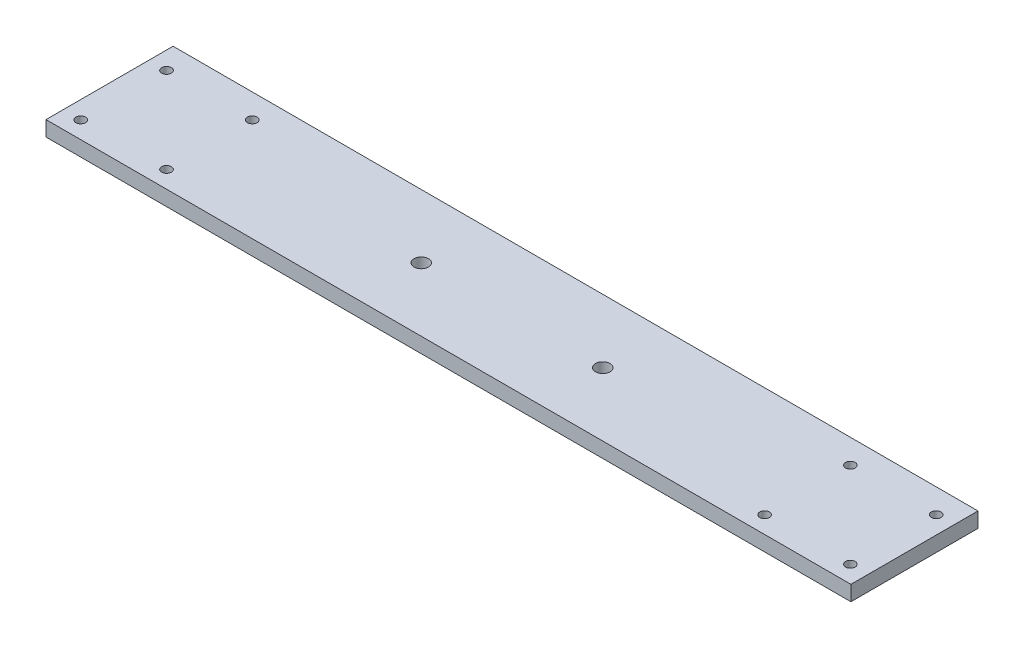
ISO-10303-21;
HEADER;
FILE_DESCRIPTION(('STEP AP214'),'2;1');
FILE_NAME('part.step','',(''),(''),'','','');
FILE_SCHEMA(('AUTOMOTIVE_DESIGN { 1 0 10303 214 1 1 1 1 }'));
ENDSEC;
DATA;
#1=APPLICATION_CONTEXT('core data for automotive mechanical design processes');
#2=APPLICATION_PROTOCOL_DEFINITION('international standard','automotive_design',2000,#1);
#3=PRODUCT_CONTEXT('',#1,'mechanical');
#4=PRODUCT('Part','Part','',(#3));
#5=PRODUCT_RELATED_PRODUCT_CATEGORY('part','',(#4));
#6=PRODUCT_DEFINITION_FORMATION('','',#4);
#7=PRODUCT_DEFINITION_CONTEXT('part definition',#1,'design');
#8=PRODUCT_DEFINITION('design','',#6,#7);
#9=PRODUCT_DEFINITION_SHAPE('','',#8);
#10=(LENGTH_UNIT() NAMED_UNIT(*) SI_UNIT(.MILLI.,.METRE.));
#11=(NAMED_UNIT(*) PLANE_ANGLE_UNIT() SI_UNIT($,.RADIAN.));
#12=(NAMED_UNIT(*) SI_UNIT($,.STERADIAN.) SOLID_ANGLE_UNIT());
#13=UNCERTAINTY_MEASURE_WITH_UNIT(LENGTH_MEASURE(1.E-05),#10,'distance_accuracy_value','');
#14=(GEOMETRIC_REPRESENTATION_CONTEXT(3) GLOBAL_UNCERTAINTY_ASSIGNED_CONTEXT((#13)) GLOBAL_UNIT_ASSIGNED_CONTEXT((#10,
#11,#12)) REPRESENTATION_CONTEXT('',''));
#15=CARTESIAN_POINT('',(0.,0.,0.));
#16=DIRECTION('',(0.,0.,1.));
#17=DIRECTION('',(1.,0.,0.));
#18=AXIS2_PLACEMENT_3D('',#15,#16,#17);
#19=CARTESIAN_POINT('',(0.,3.175,0.));
#20=DIRECTION('',(0.,1.,0.));
#21=DIRECTION('',(0.,0.,1.));
#22=AXIS2_PLACEMENT_3D('',#19,#20,#21);
#23=PLANE('',#22);
#24=CARTESIAN_POINT('',(19.05,3.175,-13.335));
#25=DIRECTION('',(0.,1.,0.));
#26=DIRECTION('',(0.,0.,1.));
#27=AXIS2_PLACEMENT_3D('',#24,#25,#26);
#28=CIRCLE('',#27,1.524);
#29=CARTESIAN_POINT('',(19.05,3.175,-11.811));
#30=VERTEX_POINT('',#29);
#31=EDGE_CURVE('E165',#30,#30,#28,.F.);
#32=ORIENTED_EDGE('',*,*,#31,.T.);
#33=EDGE_LOOP('',(#32));
#34=FACE_BOUND('',#33,.T.);
#35=CARTESIAN_POINT('',(-19.05,3.175,-13.335));
#36=DIRECTION('',(0.,1.,0.));
#37=DIRECTION('',(0.,0.,1.));
#38=AXIS2_PLACEMENT_3D('',#35,#36,#37);
#39=CIRCLE('',#38,1.524);
#40=CARTESIAN_POINT('',(-19.05,3.175,-11.811));
#41=VERTEX_POINT('',#40);
#42=EDGE_CURVE('E157',#41,#41,#39,.F.);
#43=ORIENTED_EDGE('',*,*,#42,.T.);
#44=EDGE_LOOP('',(#43));
#45=FACE_BOUND('',#44,.T.);
#46=CARTESIAN_POINT('',(-80.755,3.175,-21.59));
#47=DIRECTION('',(0.,1.,0.));
#48=DIRECTION('',(0.,0.,-1.));
#49=AXIS2_PLACEMENT_3D('',#46,#47,#48);
#50=CIRCLE('',#49,1.016);
#51=CARTESIAN_POINT('',(-80.755,3.175,-22.606));
#52=VERTEX_POINT('',#51);
#53=EDGE_CURVE('E145',#52,#52,#50,.T.);
#54=ORIENTED_EDGE('',*,*,#53,.F.);
#55=EDGE_LOOP('',(#54));
#56=FACE_BOUND('',#55,.T.);
#57=CARTESIAN_POINT('',(-80.755,3.175,-3.59));
#58=DIRECTION('',(0.,1.,0.));
#59=DIRECTION('',(0.,0.,-1.));
#60=AXIS2_PLACEMENT_3D('',#57,#58,#59);
#61=CIRCLE('',#60,1.016);
#62=CARTESIAN_POINT('',(-80.755,3.175,-4.606));
#63=VERTEX_POINT('',#62);
#64=EDGE_CURVE('E133',#63,#63,#61,.T.);
#65=ORIENTED_EDGE('',*,*,#64,.F.);
#66=EDGE_LOOP('',(#65));
#67=FACE_BOUND('',#66,.T.);
#68=CARTESIAN_POINT('',(62.755,3.175,-3.59000000000002));
#69=DIRECTION('',(0.,1.,0.));
#70=DIRECTION('',(0.,0.,1.));
#71=AXIS2_PLACEMENT_3D('',#68,#69,#70);
#72=CIRCLE('',#71,1.016);
#73=CARTESIAN_POINT('',(62.755,3.175,-2.57400000000002));
#74=VERTEX_POINT('',#73);
#75=EDGE_CURVE('E121',#74,#74,#72,.T.);
#76=ORIENTED_EDGE('',*,*,#75,.F.);
#77=EDGE_LOOP('',(#76));
#78=FACE_BOUND('',#77,.T.);
#79=CARTESIAN_POINT('',(62.755,3.175,-21.59));
#80=DIRECTION('',(0.,1.,0.));
#81=DIRECTION('',(0.,0.,1.));
#82=AXIS2_PLACEMENT_3D('',#79,#80,#81);
#83=CIRCLE('',#82,1.016);
#84=CARTESIAN_POINT('',(62.755,3.175,-20.574));
#85=VERTEX_POINT('',#84);
#86=EDGE_CURVE('E100',#85,#85,#83,.T.);
#87=ORIENTED_EDGE('',*,*,#86,.F.);
#88=EDGE_LOOP('',(#87));
#89=FACE_BOUND('',#88,.T.);
#90=DIRECTION('',(0.,0.,1.));
#91=VECTOR('',#90,1.);
#92=CARTESIAN_POINT('',(-84.455,3.175,0.));
#93=LINE('',#92,#91);
#94=CARTESIAN_POINT('',(-84.455,3.175,-26.67));
#95=VERTEX_POINT('',#94);
#96=CARTESIAN_POINT('',(-84.455,3.175,0.));
#97=VERTEX_POINT('',#96);
#98=EDGE_CURVE('E85',#95,#97,#93,.T.);
#99=ORIENTED_EDGE('',*,*,#98,.T.);
#100=DIRECTION('',(1.,0.,0.));
#101=VECTOR('',#100,1.);
#102=CARTESIAN_POINT('',(84.455,3.175,0.));
#103=LINE('',#102,#101);
#104=CARTESIAN_POINT('',(84.455,3.175,0.));
#105=VERTEX_POINT('',#104);
#106=EDGE_CURVE('E80',#97,#105,#103,.T.);
#107=ORIENTED_EDGE('',*,*,#106,.T.);
#108=DIRECTION('',(0.,0.,-1.));
#109=VECTOR('',#108,1.);
#110=CARTESIAN_POINT('',(84.455,3.175,0.));
#111=LINE('',#110,#109);
#112=CARTESIAN_POINT('',(84.455,3.175,-26.67));
#113=VERTEX_POINT('',#112);
#114=EDGE_CURVE('E83',#105,#113,#111,.T.);
#115=ORIENTED_EDGE('',*,*,#114,.T.);
#116=DIRECTION('',(-1.,0.,0.));
#117=VECTOR('',#116,1.);
#118=CARTESIAN_POINT('',(84.455,3.175,-26.67));
#119=LINE('',#118,#117);
#120=EDGE_CURVE('E50',#113,#95,#119,.T.);
#121=ORIENTED_EDGE('',*,*,#120,.T.);
#122=EDGE_LOOP('',(#99,#107,#115,#121));
#123=FACE_BOUND('',#122,.T.);
#124=CARTESIAN_POINT('',(80.755,3.175,-21.59));
#125=DIRECTION('',(0.,1.,0.));
#126=DIRECTION('',(0.,0.,1.));
#127=AXIS2_PLACEMENT_3D('',#124,#125,#126);
#128=CIRCLE('',#127,1.016);
#129=CARTESIAN_POINT('',(80.755,3.175,-20.574));
#130=VERTEX_POINT('',#129);
#131=EDGE_CURVE('E115',#130,#130,#128,.T.);
#132=ORIENTED_EDGE('',*,*,#131,.F.);
#133=EDGE_LOOP('',(#132));
#134=FACE_BOUND('',#133,.T.);
#135=CARTESIAN_POINT('',(80.755,3.175,-3.59000000000002));
#136=DIRECTION('',(0.,1.,0.));
#137=DIRECTION('',(0.,0.,1.));
#138=AXIS2_PLACEMENT_3D('',#135,#136,#137);
#139=CIRCLE('',#138,1.016);
#140=CARTESIAN_POINT('',(80.755,3.175,-2.57400000000002));
#141=VERTEX_POINT('',#140);
#142=EDGE_CURVE('E127',#141,#141,#139,.T.);
#143=ORIENTED_EDGE('',*,*,#142,.F.);
#144=EDGE_LOOP('',(#143));
#145=FACE_BOUND('',#144,.T.);
#146=CARTESIAN_POINT('',(-62.755,3.175,-3.59000000000001));
#147=DIRECTION('',(0.,1.,0.));
#148=DIRECTION('',(0.,0.,-1.));
#149=AXIS2_PLACEMENT_3D('',#146,#147,#148);
#150=CIRCLE('',#149,1.016);
#151=CARTESIAN_POINT('',(-62.755,3.175,-4.60600000000001));
#152=VERTEX_POINT('',#151);
#153=EDGE_CURVE('E139',#152,#152,#150,.T.);
#154=ORIENTED_EDGE('',*,*,#153,.F.);
#155=EDGE_LOOP('',(#154));
#156=FACE_BOUND('',#155,.T.);
#157=CARTESIAN_POINT('',(-62.755,3.175,-21.59));
#158=DIRECTION('',(0.,1.,0.));
#159=DIRECTION('',(0.,0.,-1.));
#160=AXIS2_PLACEMENT_3D('',#157,#158,#159);
#161=CIRCLE('',#160,1.016);
#162=CARTESIAN_POINT('',(-62.755,3.175,-22.606));
#163=VERTEX_POINT('',#162);
#164=EDGE_CURVE('E151',#163,#163,#161,.T.);
#165=ORIENTED_EDGE('',*,*,#164,.F.);
#166=EDGE_LOOP('',(#165));
#167=FACE_BOUND('',#166,.T.);
#168=ADVANCED_FACE('F33',(#34,#45,#56,#67,#78,#89,#123,#134,#145,#156,#167),#23,.T.);
#169=CARTESIAN_POINT('',(0.,0.,0.));
#170=DIRECTION('',(0.,1.,0.));
#171=DIRECTION('',(0.,0.,1.));
#172=AXIS2_PLACEMENT_3D('',#169,#170,#171);
#173=PLANE('',#172);
#174=CARTESIAN_POINT('',(19.05,0.,-13.335));
#175=DIRECTION('',(0.,-1.,0.));
#176=DIRECTION('',(0.,0.,-1.));
#177=AXIS2_PLACEMENT_3D('',#174,#175,#176);
#178=CIRCLE('',#177,1.524);
#179=CARTESIAN_POINT('',(19.05,0.,-14.859));
#180=VERTEX_POINT('',#179);
#181=EDGE_CURVE('E168',#180,#180,#178,.T.);
#182=ORIENTED_EDGE('',*,*,#181,.F.);
#183=EDGE_LOOP('',(#182));
#184=FACE_BOUND('',#183,.T.);
#185=CARTESIAN_POINT('',(-19.05,0.,-13.335));
#186=DIRECTION('',(0.,-1.,0.));
#187=DIRECTION('',(0.,0.,-1.));
#188=AXIS2_PLACEMENT_3D('',#185,#186,#187);
#189=CIRCLE('',#188,1.524);
#190=CARTESIAN_POINT('',(-19.05,0.,-14.859));
#191=VERTEX_POINT('',#190);
#192=EDGE_CURVE('E162',#191,#191,#189,.T.);
#193=ORIENTED_EDGE('',*,*,#192,.F.);
#194=EDGE_LOOP('',(#193));
#195=FACE_BOUND('',#194,.T.);
#196=DIRECTION('',(0.,0.,1.));
#197=VECTOR('',#196,1.);
#198=CARTESIAN_POINT('',(-84.455,0.,0.));
#199=LINE('',#198,#197);
#200=CARTESIAN_POINT('',(-84.455,0.,-26.67));
#201=VERTEX_POINT('',#200);
#202=CARTESIAN_POINT('',(-84.455,0.,0.));
#203=VERTEX_POINT('',#202);
#204=EDGE_CURVE('E97',#201,#203,#199,.T.);
#205=ORIENTED_EDGE('',*,*,#204,.F.);
#206=DIRECTION('',(-1.,0.,0.));
#207=VECTOR('',#206,1.);
#208=CARTESIAN_POINT('',(84.455,0.,-26.67));
#209=LINE('',#208,#207);
#210=CARTESIAN_POINT('',(84.455,0.,-26.67));
#211=VERTEX_POINT('',#210);
#212=EDGE_CURVE('E73',#211,#201,#209,.T.);
#213=ORIENTED_EDGE('',*,*,#212,.F.);
#214=DIRECTION('',(0.,0.,-1.));
#215=VECTOR('',#214,1.);
#216=CARTESIAN_POINT('',(84.455,0.,0.));
#217=LINE('',#216,#215);
#218=CARTESIAN_POINT('',(84.455,0.,0.));
#219=VERTEX_POINT('',#218);
#220=EDGE_CURVE('E67',#219,#211,#217,.T.);
#221=ORIENTED_EDGE('',*,*,#220,.F.);
#222=DIRECTION('',(1.,0.,0.));
#223=VECTOR('',#222,1.);
#224=CARTESIAN_POINT('',(84.455,0.,0.));
#225=LINE('',#224,#223);
#226=EDGE_CURVE('E89',#203,#219,#225,.T.);
#227=ORIENTED_EDGE('',*,*,#226,.F.);
#228=EDGE_LOOP('',(#205,#213,#221,#227));
#229=FACE_BOUND('',#228,.T.);
#230=CARTESIAN_POINT('',(62.755,0.,-21.59));
#231=DIRECTION('',(0.,1.,0.));
#232=DIRECTION('',(0.,0.,1.));
#233=AXIS2_PLACEMENT_3D('',#230,#231,#232);
#234=CIRCLE('',#233,1.016);
#235=CARTESIAN_POINT('',(62.755,0.,-20.574));
#236=VERTEX_POINT('',#235);
#237=EDGE_CURVE('E112',#236,#236,#234,.T.);
#238=ORIENTED_EDGE('',*,*,#237,.T.);
#239=EDGE_LOOP('',(#238));
#240=FACE_BOUND('',#239,.T.);
#241=CARTESIAN_POINT('',(80.755,0.,-21.59));
#242=DIRECTION('',(0.,1.,0.));
#243=DIRECTION('',(0.,0.,1.));
#244=AXIS2_PLACEMENT_3D('',#241,#242,#243);
#245=CIRCLE('',#244,1.016);
#246=CARTESIAN_POINT('',(80.755,0.,-20.574));
#247=VERTEX_POINT('',#246);
#248=EDGE_CURVE('E118',#247,#247,#245,.T.);
#249=ORIENTED_EDGE('',*,*,#248,.T.);
#250=EDGE_LOOP('',(#249));
#251=FACE_BOUND('',#250,.T.);
#252=CARTESIAN_POINT('',(62.755,0.,-3.59000000000002));
#253=DIRECTION('',(0.,1.,0.));
#254=DIRECTION('',(0.,0.,1.));
#255=AXIS2_PLACEMENT_3D('',#252,#253,#254);
#256=CIRCLE('',#255,1.016);
#257=CARTESIAN_POINT('',(62.755,0.,-2.57400000000002));
#258=VERTEX_POINT('',#257);
#259=EDGE_CURVE('E124',#258,#258,#256,.T.);
#260=ORIENTED_EDGE('',*,*,#259,.T.);
#261=EDGE_LOOP('',(#260));
#262=FACE_BOUND('',#261,.T.);
#263=CARTESIAN_POINT('',(80.755,0.,-3.59000000000002));
#264=DIRECTION('',(0.,1.,0.));
#265=DIRECTION('',(0.,0.,1.));
#266=AXIS2_PLACEMENT_3D('',#263,#264,#265);
#267=CIRCLE('',#266,1.016);
#268=CARTESIAN_POINT('',(80.755,0.,-2.57400000000002));
#269=VERTEX_POINT('',#268);
#270=EDGE_CURVE('E130',#269,#269,#267,.T.);
#271=ORIENTED_EDGE('',*,*,#270,.T.);
#272=EDGE_LOOP('',(#271));
#273=FACE_BOUND('',#272,.T.);
#274=CARTESIAN_POINT('',(-80.755,0.,-3.59));
#275=DIRECTION('',(0.,1.,0.));
#276=DIRECTION('',(0.,0.,-1.));
#277=AXIS2_PLACEMENT_3D('',#274,#275,#276);
#278=CIRCLE('',#277,1.016);
#279=CARTESIAN_POINT('',(-80.755,0.,-4.606));
#280=VERTEX_POINT('',#279);
#281=EDGE_CURVE('E136',#280,#280,#278,.T.);
#282=ORIENTED_EDGE('',*,*,#281,.T.);
#283=EDGE_LOOP('',(#282));
#284=FACE_BOUND('',#283,.T.);
#285=CARTESIAN_POINT('',(-62.755,0.,-3.59000000000001));
#286=DIRECTION('',(0.,1.,0.));
#287=DIRECTION('',(0.,0.,-1.));
#288=AXIS2_PLACEMENT_3D('',#285,#286,#287);
#289=CIRCLE('',#288,1.016);
#290=CARTESIAN_POINT('',(-62.755,0.,-4.60600000000001));
#291=VERTEX_POINT('',#290);
#292=EDGE_CURVE('E142',#291,#291,#289,.T.);
#293=ORIENTED_EDGE('',*,*,#292,.T.);
#294=EDGE_LOOP('',(#293));
#295=FACE_BOUND('',#294,.T.);
#296=CARTESIAN_POINT('',(-80.755,0.,-21.59));
#297=DIRECTION('',(0.,1.,0.));
#298=DIRECTION('',(0.,0.,-1.));
#299=AXIS2_PLACEMENT_3D('',#296,#297,#298);
#300=CIRCLE('',#299,1.016);
#301=CARTESIAN_POINT('',(-80.755,0.,-22.606));
#302=VERTEX_POINT('',#301);
#303=EDGE_CURVE('E148',#302,#302,#300,.T.);
#304=ORIENTED_EDGE('',*,*,#303,.T.);
#305=EDGE_LOOP('',(#304));
#306=FACE_BOUND('',#305,.T.);
#307=CARTESIAN_POINT('',(-62.755,0.,-21.59));
#308=DIRECTION('',(0.,1.,0.));
#309=DIRECTION('',(0.,0.,-1.));
#310=AXIS2_PLACEMENT_3D('',#307,#308,#309);
#311=CIRCLE('',#310,1.016);
#312=CARTESIAN_POINT('',(-62.755,0.,-22.606));
#313=VERTEX_POINT('',#312);
#314=EDGE_CURVE('E154',#313,#313,#311,.T.);
#315=ORIENTED_EDGE('',*,*,#314,.T.);
#316=EDGE_LOOP('',(#315));
#317=FACE_BOUND('',#316,.T.);
#318=ADVANCED_FACE('F108',(#184,#195,#229,#240,#251,#262,#273,#284,#295,#306,#317),#173,.F.);
#319=CARTESIAN_POINT('',(-84.455,3.175,0.));
#320=DIRECTION('',(1.,0.,0.));
#321=DIRECTION('',(0.,0.,-1.));
#322=AXIS2_PLACEMENT_3D('',#319,#320,#321);
#323=PLANE('',#322);
#324=ORIENTED_EDGE('',*,*,#204,.T.);
#325=DIRECTION('',(0.,-1.,0.));
#326=VECTOR('',#325,1.);
#327=CARTESIAN_POINT('',(-84.455,3.175,0.));
#328=LINE('',#327,#326);
#329=EDGE_CURVE('E11',#97,#203,#328,.T.);
#330=ORIENTED_EDGE('',*,*,#329,.F.);
#331=ORIENTED_EDGE('',*,*,#98,.F.);
#332=DIRECTION('',(0.,-1.,0.));
#333=VECTOR('',#332,1.);
#334=CARTESIAN_POINT('',(-84.455,3.175,-26.67));
#335=LINE('',#334,#333);
#336=EDGE_CURVE('E93',#95,#201,#335,.T.);
#337=ORIENTED_EDGE('',*,*,#336,.T.);
#338=EDGE_LOOP('',(#324,#330,#331,#337));
#339=FACE_BOUND('',#338,.T.);
#340=ADVANCED_FACE('F35',(#339),#323,.F.);
#341=CARTESIAN_POINT('',(84.455,3.175,0.));
#342=DIRECTION('',(0.,0.,-1.));
#343=DIRECTION('',(-1.,0.,0.));
#344=AXIS2_PLACEMENT_3D('',#341,#342,#343);
#345=PLANE('',#344);
#346=ORIENTED_EDGE('',*,*,#226,.T.);
#347=DIRECTION('',(0.,-1.,0.));
#348=VECTOR('',#347,1.);
#349=CARTESIAN_POINT('',(84.455,3.175,0.));
#350=LINE('',#349,#348);
#351=EDGE_CURVE('E42',#105,#219,#350,.T.);
#352=ORIENTED_EDGE('',*,*,#351,.F.);
#353=ORIENTED_EDGE('',*,*,#106,.F.);
#354=ORIENTED_EDGE('',*,*,#329,.T.);
#355=EDGE_LOOP('',(#346,#352,#353,#354));
#356=FACE_BOUND('',#355,.T.);
#357=ADVANCED_FACE('F88',(#356),#345,.F.);
#358=CARTESIAN_POINT('',(84.455,3.175,0.));
#359=DIRECTION('',(-1.,0.,0.));
#360=DIRECTION('',(0.,0.,1.));
#361=AXIS2_PLACEMENT_3D('',#358,#359,#360);
#362=PLANE('',#361);
#363=ORIENTED_EDGE('',*,*,#220,.T.);
#364=DIRECTION('',(0.,-1.,0.));
#365=VECTOR('',#364,1.);
#366=CARTESIAN_POINT('',(84.455,3.175,-26.67));
#367=LINE('',#366,#365);
#368=EDGE_CURVE('E90',#113,#211,#367,.T.);
#369=ORIENTED_EDGE('',*,*,#368,.F.);
#370=ORIENTED_EDGE('',*,*,#114,.F.);
#371=ORIENTED_EDGE('',*,*,#351,.T.);
#372=EDGE_LOOP('',(#363,#369,#370,#371));
#373=FACE_BOUND('',#372,.T.);
#374=ADVANCED_FACE('F91',(#373),#362,.F.);
#375=CARTESIAN_POINT('',(84.455,3.175,-26.67));
#376=DIRECTION('',(0.,0.,1.));
#377=DIRECTION('',(1.,0.,0.));
#378=AXIS2_PLACEMENT_3D('',#375,#376,#377);
#379=PLANE('',#378);
#380=ORIENTED_EDGE('',*,*,#212,.T.);
#381=ORIENTED_EDGE('',*,*,#336,.F.);
#382=ORIENTED_EDGE('',*,*,#120,.F.);
#383=ORIENTED_EDGE('',*,*,#368,.T.);
#384=EDGE_LOOP('',(#380,#381,#382,#383));
#385=FACE_BOUND('',#384,.T.);
#386=ADVANCED_FACE('F105',(#385),#379,.F.);
#387=CARTESIAN_POINT('',(62.755,3.175,-21.59));
#388=DIRECTION('',(0.,-1.,0.));
#389=DIRECTION('',(0.,0.,-1.));
#390=AXIS2_PLACEMENT_3D('',#387,#388,#389);
#391=CYLINDRICAL_SURFACE('',#390,1.016);
#392=ORIENTED_EDGE('',*,*,#86,.T.);
#393=EDGE_LOOP('',(#392));
#394=FACE_BOUND('',#393,.T.);
#395=ORIENTED_EDGE('',*,*,#237,.F.);
#396=EDGE_LOOP('',(#395));
#397=FACE_BOUND('',#396,.T.);
#398=ADVANCED_FACE('F199',(#394,#397),#391,.F.);
#399=CARTESIAN_POINT('',(80.755,3.175,-21.59));
#400=DIRECTION('',(0.,-1.,0.));
#401=DIRECTION('',(0.,0.,-1.));
#402=AXIS2_PLACEMENT_3D('',#399,#400,#401);
#403=CYLINDRICAL_SURFACE('',#402,1.016);
#404=ORIENTED_EDGE('',*,*,#131,.T.);
#405=EDGE_LOOP('',(#404));
#406=FACE_BOUND('',#405,.T.);
#407=ORIENTED_EDGE('',*,*,#248,.F.);
#408=EDGE_LOOP('',(#407));
#409=FACE_BOUND('',#408,.T.);
#410=ADVANCED_FACE('F202',(#406,#409),#403,.F.);
#411=CARTESIAN_POINT('',(62.755,3.175,-3.59000000000002));
#412=DIRECTION('',(0.,-1.,0.));
#413=DIRECTION('',(0.,0.,-1.));
#414=AXIS2_PLACEMENT_3D('',#411,#412,#413);
#415=CYLINDRICAL_SURFACE('',#414,1.016);
#416=ORIENTED_EDGE('',*,*,#75,.T.);
#417=EDGE_LOOP('',(#416));
#418=FACE_BOUND('',#417,.T.);
#419=ORIENTED_EDGE('',*,*,#259,.F.);
#420=EDGE_LOOP('',(#419));
#421=FACE_BOUND('',#420,.T.);
#422=ADVANCED_FACE('F242',(#418,#421),#415,.F.);
#423=CARTESIAN_POINT('',(80.755,3.175,-3.59000000000002));
#424=DIRECTION('',(0.,-1.,0.));
#425=DIRECTION('',(0.,0.,-1.));
#426=AXIS2_PLACEMENT_3D('',#423,#424,#425);
#427=CYLINDRICAL_SURFACE('',#426,1.016);
#428=ORIENTED_EDGE('',*,*,#142,.T.);
#429=EDGE_LOOP('',(#428));
#430=FACE_BOUND('',#429,.T.);
#431=ORIENTED_EDGE('',*,*,#270,.F.);
#432=EDGE_LOOP('',(#431));
#433=FACE_BOUND('',#432,.T.);
#434=ADVANCED_FACE('F238',(#430,#433),#427,.F.);
#435=CARTESIAN_POINT('',(-80.755,3.175,-3.59));
#436=DIRECTION('',(0.,-1.,0.));
#437=DIRECTION('',(0.,0.,-1.));
#438=AXIS2_PLACEMENT_3D('',#435,#436,#437);
#439=CYLINDRICAL_SURFACE('',#438,1.016);
#440=ORIENTED_EDGE('',*,*,#64,.T.);
#441=EDGE_LOOP('',(#440));
#442=FACE_BOUND('',#441,.T.);
#443=ORIENTED_EDGE('',*,*,#281,.F.);
#444=EDGE_LOOP('',(#443));
#445=FACE_BOUND('',#444,.T.);
#446=ADVANCED_FACE('F234',(#442,#445),#439,.F.);
#447=CARTESIAN_POINT('',(-62.755,3.175,-3.59000000000001));
#448=DIRECTION('',(0.,-1.,0.));
#449=DIRECTION('',(0.,0.,-1.));
#450=AXIS2_PLACEMENT_3D('',#447,#448,#449);
#451=CYLINDRICAL_SURFACE('',#450,1.016);
#452=ORIENTED_EDGE('',*,*,#153,.T.);
#453=EDGE_LOOP('',(#452));
#454=FACE_BOUND('',#453,.T.);
#455=ORIENTED_EDGE('',*,*,#292,.F.);
#456=EDGE_LOOP('',(#455));
#457=FACE_BOUND('',#456,.T.);
#458=ADVANCED_FACE('F227',(#454,#457),#451,.F.);
#459=CARTESIAN_POINT('',(-80.755,3.175,-21.59));
#460=DIRECTION('',(0.,-1.,0.));
#461=DIRECTION('',(0.,0.,-1.));
#462=AXIS2_PLACEMENT_3D('',#459,#460,#461);
#463=CYLINDRICAL_SURFACE('',#462,1.016);
#464=ORIENTED_EDGE('',*,*,#53,.T.);
#465=EDGE_LOOP('',(#464));
#466=FACE_BOUND('',#465,.T.);
#467=ORIENTED_EDGE('',*,*,#303,.F.);
#468=EDGE_LOOP('',(#467));
#469=FACE_BOUND('',#468,.T.);
#470=ADVANCED_FACE('F221',(#466,#469),#463,.F.);
#471=CARTESIAN_POINT('',(-62.755,3.175,-21.59));
#472=DIRECTION('',(0.,-1.,0.));
#473=DIRECTION('',(0.,0.,-1.));
#474=AXIS2_PLACEMENT_3D('',#471,#472,#473);
#475=CYLINDRICAL_SURFACE('',#474,1.016);
#476=ORIENTED_EDGE('',*,*,#164,.T.);
#477=EDGE_LOOP('',(#476));
#478=FACE_BOUND('',#477,.T.);
#479=ORIENTED_EDGE('',*,*,#314,.F.);
#480=EDGE_LOOP('',(#479));
#481=FACE_BOUND('',#480,.T.);
#482=ADVANCED_FACE('F183',(#478,#481),#475,.F.);
#483=CARTESIAN_POINT('',(-19.05,7.4855229381132,-13.335));
#484=DIRECTION('',(0.,-1.,0.));
#485=DIRECTION('',(0.,0.,-1.));
#486=AXIS2_PLACEMENT_3D('',#483,#484,#485);
#487=CYLINDRICAL_SURFACE('',#486,1.524);
#488=ORIENTED_EDGE('',*,*,#192,.T.);
#489=EDGE_LOOP('',(#488));
#490=FACE_BOUND('',#489,.T.);
#491=ORIENTED_EDGE('',*,*,#42,.F.);
#492=EDGE_LOOP('',(#491));
#493=FACE_BOUND('',#492,.T.);
#494=ADVANCED_FACE('F180',(#490,#493),#487,.F.);
#495=CARTESIAN_POINT('',(19.05,7.4855229381132,-13.335));
#496=DIRECTION('',(0.,-1.,0.));
#497=DIRECTION('',(0.,0.,-1.));
#498=AXIS2_PLACEMENT_3D('',#495,#496,#497);
#499=CYLINDRICAL_SURFACE('',#498,1.524);
#500=ORIENTED_EDGE('',*,*,#181,.T.);
#501=EDGE_LOOP('',(#500));
#502=FACE_BOUND('',#501,.T.);
#503=ORIENTED_EDGE('',*,*,#31,.F.);
#504=EDGE_LOOP('',(#503));
#505=FACE_BOUND('',#504,.T.);
#506=ADVANCED_FACE('F172',(#502,#505),#499,.F.);
#507=CLOSED_SHELL('',(#168,#318,#340,#357,#374,#386,#398,#410,#422,#434,#446,#458,#470,#482,
#494,#506));
#508=MANIFOLD_SOLID_BREP('B2',#507);
#509=ADVANCED_BREP_SHAPE_REPRESENTATION('',(#18,#508),#14);
#510=SHAPE_DEFINITION_REPRESENTATION(#9,#509);
ENDSEC;
END-ISO-10303-21;
